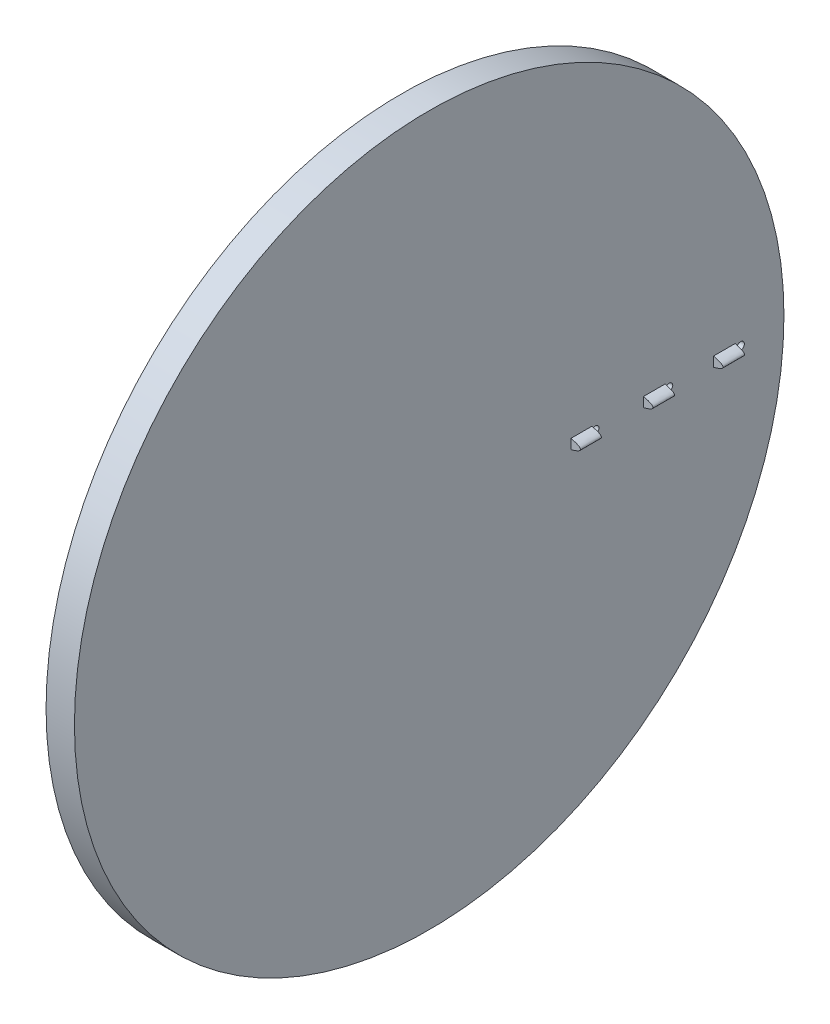
ISO-10303-21;
HEADER;
FILE_DESCRIPTION(('STEP AP214'),'2;1');
FILE_NAME('part.step','',(''),(''),'','','');
FILE_SCHEMA(('AUTOMOTIVE_DESIGN { 1 0 10303 214 1 1 1 1 }'));
ENDSEC;
DATA;
#1=APPLICATION_CONTEXT('core data for automotive mechanical design processes');
#2=APPLICATION_PROTOCOL_DEFINITION('international standard','automotive_design',2000,#1);
#3=PRODUCT_CONTEXT('',#1,'mechanical');
#4=PRODUCT('Part','Part','',(#3));
#5=PRODUCT_RELATED_PRODUCT_CATEGORY('part','',(#4));
#6=PRODUCT_DEFINITION_FORMATION('','',#4);
#7=PRODUCT_DEFINITION_CONTEXT('part definition',#1,'design');
#8=PRODUCT_DEFINITION('design','',#6,#7);
#9=PRODUCT_DEFINITION_SHAPE('','',#8);
#10=(LENGTH_UNIT() NAMED_UNIT(*) SI_UNIT(.MILLI.,.METRE.));
#11=(NAMED_UNIT(*) PLANE_ANGLE_UNIT() SI_UNIT($,.RADIAN.));
#12=(NAMED_UNIT(*) SI_UNIT($,.STERADIAN.) SOLID_ANGLE_UNIT());
#13=UNCERTAINTY_MEASURE_WITH_UNIT(LENGTH_MEASURE(1.E-05),#10,'distance_accuracy_value','');
#14=(GEOMETRIC_REPRESENTATION_CONTEXT(3) GLOBAL_UNCERTAINTY_ASSIGNED_CONTEXT((#13)) GLOBAL_UNIT_ASSIGNED_CONTEXT((#10,
#11,#12)) REPRESENTATION_CONTEXT('',''));
#15=CARTESIAN_POINT('',(0.,0.,0.));
#16=DIRECTION('',(0.,0.,1.));
#17=DIRECTION('',(1.,0.,0.));
#18=AXIS2_PLACEMENT_3D('',#15,#16,#17);
#19=CARTESIAN_POINT('',(4.,0.,-14.991885391195));
#20=DIRECTION('',(0.,0.,-1.));
#21=DIRECTION('',(-1.,0.,0.));
#22=AXIS2_PLACEMENT_3D('',#19,#20,#21);
#23=PLANE('',#22);
#24=DIRECTION('',(0.,-1.,0.));
#25=VECTOR('',#24,1.);
#26=CARTESIAN_POINT('',(3.,0.,-14.991885391195));
#27=LINE('',#26,#25);
#28=CARTESIAN_POINT('',(3.,0.,-14.991885391195));
#29=VERTEX_POINT('',#28);
#30=CARTESIAN_POINT('',(3.,-1.03124775492432,-14.991885391195));
#31=VERTEX_POINT('',#30);
#32=EDGE_CURVE('E144',#29,#31,#27,.T.);
#33=ORIENTED_EDGE('',*,*,#32,.T.);
#34=CARTESIAN_POINT('',(3.,0.,-14.991885391195));
#35=CARTESIAN_POINT('',(5.,-0.515623877462165,-14.991885391195));
#36=CARTESIAN_POINT('',(3.,-1.03124775492432,-14.991885391195));
#37=B_SPLINE_CURVE_WITH_KNOTS('',2,(#34,#35,#36),.UNSPECIFIED.,.F.,.F.,(3,3),(0.,1.),.UNSPECIFIED.);
#38=EDGE_CURVE('E132',#29,#31,#37,.T.);
#39=ORIENTED_EDGE('',*,*,#38,.F.);
#40=EDGE_LOOP('',(#33,#39));
#41=FACE_BOUND('',#40,.T.);
#42=ADVANCED_FACE('F39',(#41),#23,.F.);
#43=CARTESIAN_POINT('',(4.,0.,-17.208114608805));
#44=DIRECTION('',(0.,0.,1.));
#45=DIRECTION('',(1.,0.,0.));
#46=AXIS2_PLACEMENT_3D('',#43,#44,#45);
#47=PLANE('',#46);
#48=CARTESIAN_POINT('',(3.,0.,-17.208114608805));
#49=CARTESIAN_POINT('',(5.,-0.515623877462165,-17.208114608805));
#50=CARTESIAN_POINT('',(3.,-1.03124775492432,-17.208114608805));
#51=B_SPLINE_CURVE_WITH_KNOTS('',2,(#48,#49,#50),.UNSPECIFIED.,.F.,.F.,(3,3),(0.,1.),.UNSPECIFIED.);
#52=CARTESIAN_POINT('',(3.,-1.03124775492432,-17.208114608805));
#53=VERTEX_POINT('',#52);
#54=CARTESIAN_POINT('',(3.,0.,-17.208114608805));
#55=VERTEX_POINT('',#54);
#56=EDGE_CURVE('E383',#53,#55,#51,.F.);
#57=ORIENTED_EDGE('',*,*,#56,.F.);
#58=DIRECTION('',(0.,1.,0.));
#59=VECTOR('',#58,1.);
#60=CARTESIAN_POINT('',(3.,0.,-17.208114608805));
#61=LINE('',#60,#59);
#62=EDGE_CURVE('E152',#53,#55,#61,.T.);
#63=ORIENTED_EDGE('',*,*,#62,.T.);
#64=EDGE_LOOP('',(#57,#63));
#65=FACE_BOUND('',#64,.T.);
#66=ADVANCED_FACE('F207',(#65),#47,.F.);
#67=CARTESIAN_POINT('',(4.,0.,-22.6611570515887));
#68=DIRECTION('',(0.,0.,-1.));
#69=DIRECTION('',(-1.,0.,0.));
#70=AXIS2_PLACEMENT_3D('',#67,#68,#69);
#71=PLANE('',#70);
#72=DIRECTION('',(0.,-1.,0.));
#73=VECTOR('',#72,1.);
#74=CARTESIAN_POINT('',(3.,0.,-22.6611570515887));
#75=LINE('',#74,#73);
#76=CARTESIAN_POINT('',(3.,0.,-22.6611570515887));
#77=VERTEX_POINT('',#76);
#78=CARTESIAN_POINT('',(3.,-1.03124775492432,-22.6611570515887));
#79=VERTEX_POINT('',#78);
#80=EDGE_CURVE('E116',#77,#79,#75,.T.);
#81=ORIENTED_EDGE('',*,*,#80,.T.);
#82=CARTESIAN_POINT('',(3.,0.,-22.6611570515887));
#83=CARTESIAN_POINT('',(5.,-0.515623877462165,-22.6611570515887));
#84=CARTESIAN_POINT('',(3.,-1.03124775492432,-22.6611570515887));
#85=B_SPLINE_CURVE_WITH_KNOTS('',2,(#82,#83,#84),.UNSPECIFIED.,.F.,.F.,(3,3),(0.,1.),.UNSPECIFIED.);
#86=EDGE_CURVE('E373',#77,#79,#85,.T.);
#87=ORIENTED_EDGE('',*,*,#86,.F.);
#88=EDGE_LOOP('',(#81,#87));
#89=FACE_BOUND('',#88,.T.);
#90=ADVANCED_FACE('F213',(#89),#71,.F.);
#91=CARTESIAN_POINT('',(4.,0.,-24.9388429484113));
#92=DIRECTION('',(0.,0.,1.));
#93=DIRECTION('',(1.,0.,0.));
#94=AXIS2_PLACEMENT_3D('',#91,#92,#93);
#95=PLANE('',#94);
#96=CARTESIAN_POINT('',(3.,0.,-24.9388429484113));
#97=CARTESIAN_POINT('',(5.,-0.515623877462165,-24.9388429484113));
#98=CARTESIAN_POINT('',(3.,-1.03124775492432,-24.9388429484113));
#99=B_SPLINE_CURVE_WITH_KNOTS('',2,(#96,#97,#98),.UNSPECIFIED.,.F.,.F.,(3,3),(0.,1.),.UNSPECIFIED.);
#100=CARTESIAN_POINT('',(3.,-1.03124775492432,-24.9388429484113));
#101=VERTEX_POINT('',#100);
#102=CARTESIAN_POINT('',(3.,0.,-24.9388429484113));
#103=VERTEX_POINT('',#102);
#104=EDGE_CURVE('E65',#101,#103,#99,.F.);
#105=ORIENTED_EDGE('',*,*,#104,.F.);
#106=DIRECTION('',(0.,1.,0.));
#107=VECTOR('',#106,1.);
#108=CARTESIAN_POINT('',(3.,0.,-24.9388429484113));
#109=LINE('',#108,#107);
#110=EDGE_CURVE('E135',#101,#103,#109,.T.);
#111=ORIENTED_EDGE('',*,*,#110,.T.);
#112=EDGE_LOOP('',(#105,#111));
#113=FACE_BOUND('',#112,.T.);
#114=ADVANCED_FACE('F254',(#113),#95,.F.);
#115=CARTESIAN_POINT('',(4.,0.,-30.0611570515888));
#116=DIRECTION('',(0.,0.,-1.));
#117=DIRECTION('',(-1.,0.,0.));
#118=AXIS2_PLACEMENT_3D('',#115,#116,#117);
#119=PLANE('',#118);
#120=DIRECTION('',(0.,-1.,0.));
#121=VECTOR('',#120,1.);
#122=CARTESIAN_POINT('',(3.,0.,-30.0611570515888));
#123=LINE('',#122,#121);
#124=CARTESIAN_POINT('',(3.,0.,-30.0611570515887));
#125=VERTEX_POINT('',#124);
#126=CARTESIAN_POINT('',(3.,-1.03124775492432,-30.0611570515887));
#127=VERTEX_POINT('',#126);
#128=EDGE_CURVE('E109',#125,#127,#123,.T.);
#129=ORIENTED_EDGE('',*,*,#128,.T.);
#130=CARTESIAN_POINT('',(3.,0.,-30.0611570515887));
#131=CARTESIAN_POINT('',(5.,-0.515623877462165,-30.0611570515887));
#132=CARTESIAN_POINT('',(3.,-1.03124775492432,-30.0611570515887));
#133=B_SPLINE_CURVE_WITH_KNOTS('',2,(#130,#131,#132),.UNSPECIFIED.,.F.,.F.,(3,3),(0.,1.),.UNSPECIFIED.);
#134=EDGE_CURVE('E100',#125,#127,#133,.T.);
#135=ORIENTED_EDGE('',*,*,#134,.F.);
#136=EDGE_LOOP('',(#129,#135));
#137=FACE_BOUND('',#136,.T.);
#138=ADVANCED_FACE('F246',(#137),#119,.F.);
#139=CARTESIAN_POINT('',(4.,0.,-32.3388429484112));
#140=DIRECTION('',(0.,0.,1.));
#141=DIRECTION('',(1.,0.,0.));
#142=AXIS2_PLACEMENT_3D('',#139,#140,#141);
#143=PLANE('',#142);
#144=CARTESIAN_POINT('',(3.,0.,-32.3388429484112));
#145=CARTESIAN_POINT('',(5.,-0.515623877462165,-32.3388429484112));
#146=CARTESIAN_POINT('',(3.,-1.03124775492432,-32.3388429484112));
#147=B_SPLINE_CURVE_WITH_KNOTS('',2,(#144,#145,#146),.UNSPECIFIED.,.F.,.F.,(3,3),(0.,1.),.UNSPECIFIED.);
#148=CARTESIAN_POINT('',(3.,0.,-32.3388429484112));
#149=VERTEX_POINT('',#148);
#150=CARTESIAN_POINT('',(3.,-1.03124775492432,-32.3388429484112));
#151=VERTEX_POINT('',#150);
#152=EDGE_CURVE('E94',#149,#151,#147,.T.);
#153=ORIENTED_EDGE('',*,*,#152,.T.);
#154=DIRECTION('',(0.,1.,0.));
#155=VECTOR('',#154,1.);
#156=CARTESIAN_POINT('',(3.,0.,-32.3388429484112));
#157=LINE('',#156,#155);
#158=EDGE_CURVE('E98',#151,#149,#157,.T.);
#159=ORIENTED_EDGE('',*,*,#158,.T.);
#160=EDGE_LOOP('',(#153,#159));
#161=FACE_BOUND('',#160,.T.);
#162=ADVANCED_FACE('F96',(#161),#143,.F.);
#163=CARTESIAN_POINT('',(3.,0.,0.));
#164=DIRECTION('',(1.,0.,0.));
#165=DIRECTION('',(0.,0.,-1.));
#166=AXIS2_PLACEMENT_3D('',#163,#164,#165);
#167=PLANE('',#166);
#168=CARTESIAN_POINT('',(3.,-0.515623877462161,-17.5862192796217));
#169=DIRECTION('',(1.,0.,0.));
#170=DIRECTION('',(0.,0.,-1.));
#171=AXIS2_PLACEMENT_3D('',#168,#169,#170);
#172=CIRCLE('',#171,0.359679389546414);
#173=CARTESIAN_POINT('',(3.,-0.515623877462161,-17.9458986691681));
#174=VERTEX_POINT('',#173);
#175=EDGE_CURVE('E183',#174,#174,#172,.T.);
#176=ORIENTED_EDGE('',*,*,#175,.F.);
#177=EDGE_LOOP('',(#176));
#178=FACE_BOUND('',#177,.T.);
#179=CARTESIAN_POINT('',(3.,-0.515623877462161,-25.3807982869247));
#180=DIRECTION('',(1.,0.,0.));
#181=DIRECTION('',(0.,0.,-1.));
#182=AXIS2_PLACEMENT_3D('',#179,#180,#181);
#183=CIRCLE('',#182,0.365171253685525);
#184=CARTESIAN_POINT('',(3.,-0.515623877462161,-25.7459695406103));
#185=VERTEX_POINT('',#184);
#186=EDGE_CURVE('E413',#185,#185,#183,.T.);
#187=ORIENTED_EDGE('',*,*,#186,.F.);
#188=EDGE_LOOP('',(#187));
#189=FACE_BOUND('',#188,.T.);
#190=CARTESIAN_POINT('',(3.,-0.515623877462161,-32.9156176774106));
#191=DIRECTION('',(1.,0.,0.));
#192=DIRECTION('',(0.,0.,-1.));
#193=AXIS2_PLACEMENT_3D('',#190,#191,#192);
#194=CIRCLE('',#193,0.400306504496249);
#195=CARTESIAN_POINT('',(3.,-0.515623877462161,-33.3159241819068));
#196=VERTEX_POINT('',#195);
#197=EDGE_CURVE('E351',#196,#196,#194,.T.);
#198=ORIENTED_EDGE('',*,*,#197,.F.);
#199=EDGE_LOOP('',(#198));
#200=FACE_BOUND('',#199,.T.);
#201=DIRECTION('',(0.,0.,-1.));
#202=VECTOR('',#201,1.);
#203=CARTESIAN_POINT('',(3.,-1.03124775492433,-14.991885391195));
#204=LINE('',#203,#202);
#205=EDGE_CURVE('E156',#31,#53,#204,.T.);
#206=ORIENTED_EDGE('',*,*,#205,.F.);
#207=ORIENTED_EDGE('',*,*,#32,.F.);
#208=DIRECTION('',(0.,0.,1.));
#209=VECTOR('',#208,1.);
#210=CARTESIAN_POINT('',(3.,0.,-14.991885391195));
#211=LINE('',#210,#209);
#212=EDGE_CURVE('E126',#55,#29,#211,.T.);
#213=ORIENTED_EDGE('',*,*,#212,.F.);
#214=ORIENTED_EDGE('',*,*,#62,.F.);
#215=EDGE_LOOP('',(#206,#207,#213,#214));
#216=FACE_BOUND('',#215,.T.);
#217=DIRECTION('',(0.,0.,-1.));
#218=VECTOR('',#217,1.);
#219=CARTESIAN_POINT('',(3.,-1.03124775492433,-22.6611570515887));
#220=LINE('',#219,#218);
#221=EDGE_CURVE('E139',#79,#101,#220,.T.);
#222=ORIENTED_EDGE('',*,*,#221,.F.);
#223=ORIENTED_EDGE('',*,*,#80,.F.);
#224=DIRECTION('',(0.,0.,1.));
#225=VECTOR('',#224,1.);
#226=CARTESIAN_POINT('',(3.,0.,-22.6611570515887));
#227=LINE('',#226,#225);
#228=EDGE_CURVE('E138',#103,#77,#227,.T.);
#229=ORIENTED_EDGE('',*,*,#228,.F.);
#230=ORIENTED_EDGE('',*,*,#110,.F.);
#231=EDGE_LOOP('',(#222,#223,#229,#230));
#232=FACE_BOUND('',#231,.T.);
#233=DIRECTION('',(0.,0.,-1.));
#234=VECTOR('',#233,1.);
#235=CARTESIAN_POINT('',(3.,-1.03124775492432,-30.0611570515888));
#236=LINE('',#235,#234);
#237=EDGE_CURVE('E103',#127,#151,#236,.T.);
#238=ORIENTED_EDGE('',*,*,#237,.F.);
#239=ORIENTED_EDGE('',*,*,#128,.F.);
#240=DIRECTION('',(0.,0.,1.));
#241=VECTOR('',#240,1.);
#242=CARTESIAN_POINT('',(3.,0.,-30.0611570515888));
#243=LINE('',#242,#241);
#244=EDGE_CURVE('E57',#149,#125,#243,.T.);
#245=ORIENTED_EDGE('',*,*,#244,.F.);
#246=ORIENTED_EDGE('',*,*,#158,.F.);
#247=EDGE_LOOP('',(#238,#239,#245,#246));
#248=FACE_BOUND('',#247,.T.);
#249=CARTESIAN_POINT('',(3.,0.,0.));
#250=DIRECTION('',(1.,0.,0.));
#251=DIRECTION('',(0.,0.,-1.));
#252=AXIS2_PLACEMENT_3D('',#249,#250,#251);
#253=CIRCLE('',#252,37.5);
#254=CARTESIAN_POINT('',(3.,0.,-37.5));
#255=VERTEX_POINT('',#254);
#256=EDGE_CURVE('E11',#255,#255,#253,.T.);
#257=ORIENTED_EDGE('',*,*,#256,.T.);
#258=EDGE_LOOP('',(#257));
#259=FACE_BOUND('',#258,.T.);
#260=ADVANCED_FACE('F111',(#178,#189,#200,#216,#232,#248,#259),#167,.T.);
#261=CARTESIAN_POINT('',(3.,0.,0.));
#262=DIRECTION('',(-1.,0.,0.));
#263=DIRECTION('',(0.,0.,1.));
#264=AXIS2_PLACEMENT_3D('',#261,#262,#263);
#265=CYLINDRICAL_SURFACE('',#264,37.5);
#266=ORIENTED_EDGE('',*,*,#256,.F.);
#267=EDGE_LOOP('',(#266));
#268=FACE_BOUND('',#267,.T.);
#269=CARTESIAN_POINT('',(0.,0.,0.));
#270=DIRECTION('',(1.,0.,0.));
#271=DIRECTION('',(0.,0.,-1.));
#272=AXIS2_PLACEMENT_3D('',#269,#270,#271);
#273=CIRCLE('',#272,37.5);
#274=CARTESIAN_POINT('',(0.,0.,-37.5));
#275=VERTEX_POINT('',#274);
#276=EDGE_CURVE('E49',#275,#275,#273,.T.);
#277=ORIENTED_EDGE('',*,*,#276,.T.);
#278=EDGE_LOOP('',(#277));
#279=FACE_BOUND('',#278,.T.);
#280=ADVANCED_FACE('F41',(#268,#279),#265,.T.);
#281=CARTESIAN_POINT('',(0.,0.,0.));
#282=DIRECTION('',(1.,0.,0.));
#283=DIRECTION('',(0.,0.,-1.));
#284=AXIS2_PLACEMENT_3D('',#281,#282,#283);
#285=PLANE('',#284);
#286=CARTESIAN_POINT('',(0.,-0.515623877462161,-17.5862192796217));
#287=DIRECTION('',(1.,0.,0.));
#288=DIRECTION('',(0.,0.,-1.));
#289=AXIS2_PLACEMENT_3D('',#286,#287,#288);
#290=CIRCLE('',#289,0.359679389546414);
#291=CARTESIAN_POINT('',(0.,-0.515623877462161,-17.9458986691681));
#292=VERTEX_POINT('',#291);
#293=EDGE_CURVE('E43',#292,#292,#290,.T.);
#294=ORIENTED_EDGE('',*,*,#293,.T.);
#295=EDGE_LOOP('',(#294));
#296=FACE_BOUND('',#295,.T.);
#297=CARTESIAN_POINT('',(0.,-0.515623877462161,-25.3807982869247));
#298=DIRECTION('',(1.,0.,0.));
#299=DIRECTION('',(0.,0.,-1.));
#300=AXIS2_PLACEMENT_3D('',#297,#298,#299);
#301=CIRCLE('',#300,0.365171253685525);
#302=CARTESIAN_POINT('',(0.,-0.515623877462161,-25.7459695406103));
#303=VERTEX_POINT('',#302);
#304=EDGE_CURVE('E182',#303,#303,#301,.T.);
#305=ORIENTED_EDGE('',*,*,#304,.T.);
#306=EDGE_LOOP('',(#305));
#307=FACE_BOUND('',#306,.T.);
#308=CARTESIAN_POINT('',(0.,-0.515623877462161,-32.9156176774106));
#309=DIRECTION('',(1.,0.,0.));
#310=DIRECTION('',(0.,0.,-1.));
#311=AXIS2_PLACEMENT_3D('',#308,#309,#310);
#312=CIRCLE('',#311,0.400306504496249);
#313=CARTESIAN_POINT('',(0.,-0.515623877462161,-33.3159241819068));
#314=VERTEX_POINT('',#313);
#315=EDGE_CURVE('E179',#314,#314,#312,.T.);
#316=ORIENTED_EDGE('',*,*,#315,.T.);
#317=EDGE_LOOP('',(#316));
#318=FACE_BOUND('',#317,.T.);
#319=ORIENTED_EDGE('',*,*,#276,.F.);
#320=EDGE_LOOP('',(#319));
#321=FACE_BOUND('',#320,.T.);
#322=ADVANCED_FACE('F192',(#296,#307,#318,#321),#285,.F.);
#323=CARTESIAN_POINT('',(3.,0.,-12.3388429484112));
#324=CARTESIAN_POINT('',(5.,-0.515623877462165,-12.3388429484112));
#325=CARTESIAN_POINT('',(3.,-1.03124775492432,-12.3388429484112));
#326=B_SPLINE_CURVE_WITH_KNOTS('',2,(#323,#324,#325),.UNSPECIFIED.,.F.,.F.,(3,3),(0.,1.),.UNSPECIFIED.);
#327=DIRECTION('',(0.,0.,-1.));
#328=VECTOR('',#327,1.);
#329=SURFACE_OF_LINEAR_EXTRUSION('',#326,#328);
#330=ORIENTED_EDGE('',*,*,#134,.T.);
#331=ORIENTED_EDGE('',*,*,#237,.T.);
#332=ORIENTED_EDGE('',*,*,#152,.F.);
#333=ORIENTED_EDGE('',*,*,#244,.T.);
#334=EDGE_LOOP('',(#330,#331,#332,#333));
#335=FACE_BOUND('',#334,.T.);
#336=ADVANCED_FACE('F104',(#335),#329,.T.);
#337=ORIENTED_EDGE('',*,*,#86,.T.);
#338=ORIENTED_EDGE('',*,*,#221,.T.);
#339=ORIENTED_EDGE('',*,*,#104,.T.);
#340=ORIENTED_EDGE('',*,*,#228,.T.);
#341=EDGE_LOOP('',(#337,#338,#339,#340));
#342=FACE_BOUND('',#341,.T.);
#343=ADVANCED_FACE('F225',(#342),#329,.T.);
#344=ORIENTED_EDGE('',*,*,#38,.T.);
#345=ORIENTED_EDGE('',*,*,#205,.T.);
#346=ORIENTED_EDGE('',*,*,#56,.T.);
#347=ORIENTED_EDGE('',*,*,#212,.T.);
#348=EDGE_LOOP('',(#344,#345,#346,#347));
#349=FACE_BOUND('',#348,.T.);
#350=ADVANCED_FACE('F227',(#349),#329,.T.);
#351=CARTESIAN_POINT('',(-17.,-0.515623877462161,-32.9156176774106));
#352=DIRECTION('',(1.,0.,0.));
#353=DIRECTION('',(0.,0.,-1.));
#354=AXIS2_PLACEMENT_3D('',#351,#352,#353);
#355=CYLINDRICAL_SURFACE('',#354,0.400306504496249);
#356=ORIENTED_EDGE('',*,*,#197,.T.);
#357=EDGE_LOOP('',(#356));
#358=FACE_BOUND('',#357,.T.);
#359=ORIENTED_EDGE('',*,*,#315,.F.);
#360=EDGE_LOOP('',(#359));
#361=FACE_BOUND('',#360,.T.);
#362=ADVANCED_FACE('F202',(#358,#361),#355,.F.);
#363=CARTESIAN_POINT('',(-17.,-0.515623877462161,-25.3807982869247));
#364=DIRECTION('',(1.,0.,0.));
#365=DIRECTION('',(0.,0.,-1.));
#366=AXIS2_PLACEMENT_3D('',#363,#364,#365);
#367=CYLINDRICAL_SURFACE('',#366,0.365171253685525);
#368=ORIENTED_EDGE('',*,*,#186,.T.);
#369=EDGE_LOOP('',(#368));
#370=FACE_BOUND('',#369,.T.);
#371=ORIENTED_EDGE('',*,*,#304,.F.);
#372=EDGE_LOOP('',(#371));
#373=FACE_BOUND('',#372,.T.);
#374=ADVANCED_FACE('F196',(#370,#373),#367,.F.);
#375=CARTESIAN_POINT('',(-17.,-0.515623877462161,-17.5862192796217));
#376=DIRECTION('',(1.,0.,0.));
#377=DIRECTION('',(0.,0.,-1.));
#378=AXIS2_PLACEMENT_3D('',#375,#376,#377);
#379=CYLINDRICAL_SURFACE('',#378,0.359679389546414);
#380=ORIENTED_EDGE('',*,*,#175,.T.);
#381=EDGE_LOOP('',(#380));
#382=FACE_BOUND('',#381,.T.);
#383=ORIENTED_EDGE('',*,*,#293,.F.);
#384=EDGE_LOOP('',(#383));
#385=FACE_BOUND('',#384,.T.);
#386=ADVANCED_FACE('F194',(#382,#385),#379,.F.);
#387=CLOSED_SHELL('',(#42,#66,#90,#114,#138,#162,#260,#280,#322,#336,#343,#350,#362,#374,#386));
#388=MANIFOLD_SOLID_BREP('B2',#387);
#389=ADVANCED_BREP_SHAPE_REPRESENTATION('',(#18,#388),#14);
#390=SHAPE_DEFINITION_REPRESENTATION(#9,#389);
ENDSEC;
END-ISO-10303-21;
